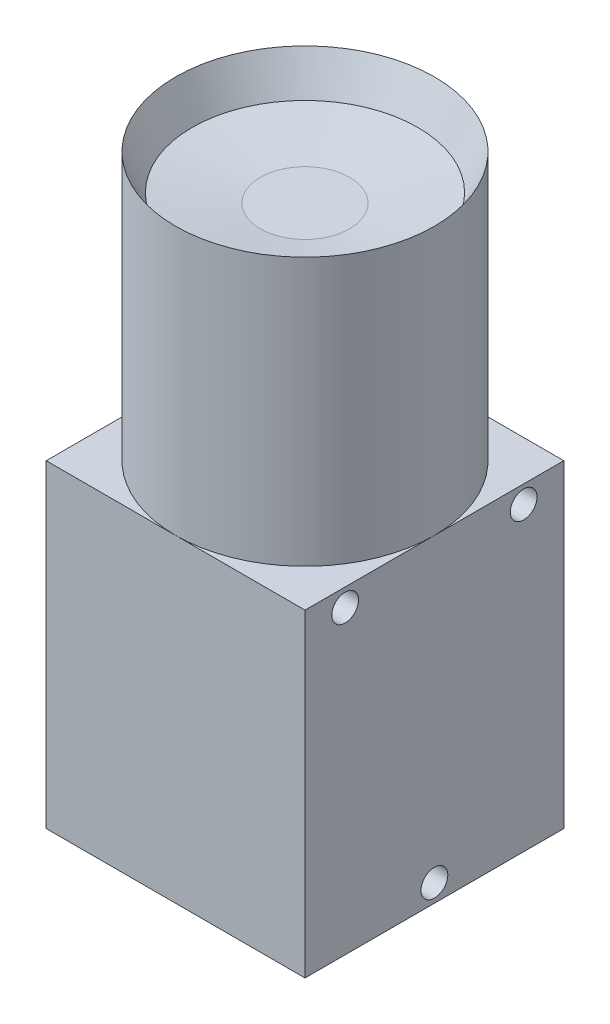
ISO-10303-21;
HEADER;
FILE_DESCRIPTION(('STEP AP214'),'2;1');
FILE_NAME('part.step','',(''),(''),'','','');
FILE_SCHEMA(('AUTOMOTIVE_DESIGN { 1 0 10303 214 1 1 1 1 }'));
ENDSEC;
DATA;
#1=APPLICATION_CONTEXT('core data for automotive mechanical design processes');
#2=APPLICATION_PROTOCOL_DEFINITION('international standard','automotive_design',2000,#1);
#3=PRODUCT_CONTEXT('',#1,'mechanical');
#4=PRODUCT('Part','Part','',(#3));
#5=PRODUCT_RELATED_PRODUCT_CATEGORY('part','',(#4));
#6=PRODUCT_DEFINITION_FORMATION('','',#4);
#7=PRODUCT_DEFINITION_CONTEXT('part definition',#1,'design');
#8=PRODUCT_DEFINITION('design','',#6,#7);
#9=PRODUCT_DEFINITION_SHAPE('','',#8);
#10=(LENGTH_UNIT() NAMED_UNIT(*) SI_UNIT(.MILLI.,.METRE.));
#11=(NAMED_UNIT(*) PLANE_ANGLE_UNIT() SI_UNIT($,.RADIAN.));
#12=(NAMED_UNIT(*) SI_UNIT($,.STERADIAN.) SOLID_ANGLE_UNIT());
#13=UNCERTAINTY_MEASURE_WITH_UNIT(LENGTH_MEASURE(1.E-05),#10,'distance_accuracy_value','');
#14=(GEOMETRIC_REPRESENTATION_CONTEXT(3) GLOBAL_UNCERTAINTY_ASSIGNED_CONTEXT((#13)) GLOBAL_UNIT_ASSIGNED_CONTEXT((#10,
#11,#12)) REPRESENTATION_CONTEXT('',''));
#15=CARTESIAN_POINT('',(0.,0.,0.));
#16=DIRECTION('',(0.,0.,1.));
#17=DIRECTION('',(1.,0.,0.));
#18=AXIS2_PLACEMENT_3D('',#15,#16,#17);
#19=CARTESIAN_POINT('',(10.,-2.,-10.5));
#20=DIRECTION('',(0.,0.,-1.));
#21=DIRECTION('',(-1.,0.,0.));
#22=AXIS2_PLACEMENT_3D('',#19,#20,#21);
#23=PLANE('',#22);
#24=DIRECTION('',(1.,0.,0.));
#25=VECTOR('',#24,1.);
#26=CARTESIAN_POINT('',(-14.501,-0.5857864376269,-10.5));
#27=LINE('',#26,#25);
#28=CARTESIAN_POINT('',(10.5,-0.585786437626899,-10.5));
#29=VERTEX_POINT('',#28);
#30=CARTESIAN_POINT('',(9.50000000000002,-0.585786437626899,-10.5));
#31=VERTEX_POINT('',#30);
#32=EDGE_CURVE('E275',#29,#31,#27,.F.);
#33=ORIENTED_EDGE('',*,*,#32,.T.);
#34=CARTESIAN_POINT('',(10.,-2.,-10.5));
#35=DIRECTION('',(0.,0.,-1.));
#36=DIRECTION('',(-1.,0.,0.));
#37=AXIS2_PLACEMENT_3D('',#34,#35,#36);
#38=CIRCLE('',#37,1.5);
#39=EDGE_CURVE('E139',#31,#29,#38,.T.);
#40=ORIENTED_EDGE('',*,*,#39,.T.);
#41=EDGE_LOOP('',(#33,#40));
#42=FACE_BOUND('',#41,.T.);
#43=ADVANCED_FACE('F35',(#42),#23,.T.);
#44=CARTESIAN_POINT('',(-10.,-2.,-10.5));
#45=DIRECTION('',(0.,0.,1.));
#46=DIRECTION('',(1.,0.,0.));
#47=AXIS2_PLACEMENT_3D('',#44,#45,#46);
#48=PLANE('',#47);
#49=CARTESIAN_POINT('',(-10.,-2.,-10.5));
#50=DIRECTION('',(0.,0.,-1.));
#51=DIRECTION('',(1.,0.,0.));
#52=AXIS2_PLACEMENT_3D('',#49,#50,#51);
#53=CIRCLE('',#52,1.5);
#54=CARTESIAN_POINT('',(-9.50000000000001,-3.4142135623731,-10.5));
#55=VERTEX_POINT('',#54);
#56=CARTESIAN_POINT('',(-10.5,-3.4142135623731,-10.5));
#57=VERTEX_POINT('',#56);
#58=EDGE_CURVE('E127',#55,#57,#53,.T.);
#59=ORIENTED_EDGE('',*,*,#58,.T.);
#60=DIRECTION('',(1.,0.,0.));
#61=VECTOR('',#60,1.);
#62=CARTESIAN_POINT('',(-14.501,-3.4142135623731,-10.5));
#63=LINE('',#62,#61);
#64=EDGE_CURVE('E270',#55,#57,#63,.F.);
#65=ORIENTED_EDGE('',*,*,#64,.F.);
#66=EDGE_LOOP('',(#59,#65));
#67=FACE_BOUND('',#66,.T.);
#68=ADVANCED_FACE('F244',(#67),#48,.F.);
#69=CARTESIAN_POINT('',(0.,25.,0.));
#70=DIRECTION('',(0.,1.,0.));
#71=DIRECTION('',(-1.,0.,0.));
#72=AXIS2_PLACEMENT_3D('',#69,#70,#71);
#73=CYLINDRICAL_SURFACE('',#72,14.5);
#74=CARTESIAN_POINT('',(0.,0.,0.));
#75=DIRECTION('',(0.,1.,0.));
#76=DIRECTION('',(-1.,0.,0.));
#77=AXIS2_PLACEMENT_3D('',#74,#75,#76);
#78=CIRCLE('',#77,14.5);
#79=CARTESIAN_POINT('',(-14.5,0.,0.));
#80=VERTEX_POINT('',#79);
#81=CARTESIAN_POINT('',(0.,0.,14.5));
#82=VERTEX_POINT('',#81);
#83=EDGE_CURVE('E11',#80,#82,#78,.T.);
#84=ORIENTED_EDGE('',*,*,#83,.T.);
#85=CARTESIAN_POINT('',(14.5,0.,0.));
#86=VERTEX_POINT('',#85);
#87=EDGE_CURVE('E43',#82,#86,#78,.T.);
#88=ORIENTED_EDGE('',*,*,#87,.T.);
#89=CARTESIAN_POINT('',(0.,0.,-14.5));
#90=VERTEX_POINT('',#89);
#91=EDGE_CURVE('E193',#86,#90,#78,.T.);
#92=ORIENTED_EDGE('',*,*,#91,.T.);
#93=EDGE_CURVE('E44',#90,#80,#78,.T.);
#94=ORIENTED_EDGE('',*,*,#93,.T.);
#95=EDGE_LOOP('',(#84,#88,#92,#94));
#96=FACE_BOUND('',#95,.T.);
#97=CARTESIAN_POINT('',(0.,30.,0.));
#98=DIRECTION('',(0.,1.,0.));
#99=DIRECTION('',(-1.,0.,0.));
#100=AXIS2_PLACEMENT_3D('',#97,#98,#99);
#101=CIRCLE('',#100,14.5);
#102=CARTESIAN_POINT('',(-14.5,30.,0.));
#103=VERTEX_POINT('',#102);
#104=EDGE_CURVE('E188',#103,#103,#101,.T.);
#105=ORIENTED_EDGE('',*,*,#104,.F.);
#106=EDGE_LOOP('',(#105));
#107=FACE_BOUND('',#106,.T.);
#108=ADVANCED_FACE('F37',(#96,#107),#73,.T.);
#109=CARTESIAN_POINT('',(0.,26.0180368412376,0.));
#110=DIRECTION('',(0.,1.,0.));
#111=DIRECTION('',(-1.,0.,0.));
#112=AXIS2_PLACEMENT_3D('',#109,#110,#111);
#113=CONICAL_SURFACE('',#112,12.6468737891716,0.435570110109196);
#114=ORIENTED_EDGE('',*,*,#104,.T.);
#115=EDGE_LOOP('',(#114));
#116=FACE_BOUND('',#115,.T.);
#117=CARTESIAN_POINT('',(0.,26.0180368412376,0.));
#118=DIRECTION('',(0.,1.,0.));
#119=DIRECTION('',(-1.,0.,0.));
#120=AXIS2_PLACEMENT_3D('',#117,#118,#119);
#121=CIRCLE('',#120,12.6468737891716);
#122=CARTESIAN_POINT('',(-12.6468737891716,26.0180368412376,0.));
#123=VERTEX_POINT('',#122);
#124=EDGE_CURVE('E186',#123,#123,#121,.T.);
#125=ORIENTED_EDGE('',*,*,#124,.F.);
#126=EDGE_LOOP('',(#125));
#127=FACE_BOUND('',#126,.T.);
#128=ADVANCED_FACE('F465',(#116,#127),#113,.F.);
#129=CARTESIAN_POINT('',(0.,25.,0.));
#130=DIRECTION('',(0.,1.,0.));
#131=DIRECTION('',(-1.,0.,0.));
#132=AXIS2_PLACEMENT_3D('',#129,#130,#131);
#133=CONICAL_SURFACE('',#132,5.,1.43844348494106);
#134=ORIENTED_EDGE('',*,*,#124,.T.);
#135=EDGE_LOOP('',(#134));
#136=FACE_BOUND('',#135,.T.);
#137=CARTESIAN_POINT('',(0.,25.,0.));
#138=DIRECTION('',(0.,1.,0.));
#139=DIRECTION('',(-1.,0.,0.));
#140=AXIS2_PLACEMENT_3D('',#137,#138,#139);
#141=CIRCLE('',#140,5.);
#142=CARTESIAN_POINT('',(-5.,25.,0.));
#143=VERTEX_POINT('',#142);
#144=EDGE_CURVE('E183',#143,#143,#141,.T.);
#145=ORIENTED_EDGE('',*,*,#144,.F.);
#146=EDGE_LOOP('',(#145));
#147=FACE_BOUND('',#146,.T.);
#148=ADVANCED_FACE('F456',(#136,#147),#133,.F.);
#149=CARTESIAN_POINT('',(-5.,25.,0.));
#150=DIRECTION('',(0.,1.,0.));
#151=DIRECTION('',(-1.,0.,0.));
#152=AXIS2_PLACEMENT_3D('',#149,#150,#151);
#153=PLANE('',#152);
#154=ORIENTED_EDGE('',*,*,#144,.T.);
#155=EDGE_LOOP('',(#154));
#156=FACE_BOUND('',#155,.T.);
#157=ADVANCED_FACE('F448',(#156),#153,.T.);
#158=CARTESIAN_POINT('',(0.,0.,0.));
#159=DIRECTION('',(0.,-1.,0.));
#160=DIRECTION('',(1.,0.,0.));
#161=AXIS2_PLACEMENT_3D('',#158,#159,#160);
#162=PLANE('',#161);
#163=ORIENTED_EDGE('',*,*,#83,.F.);
#164=DIRECTION('',(0.,0.,-1.));
#165=VECTOR('',#164,1.);
#166=CARTESIAN_POINT('',(-14.5,0.,14.5));
#167=LINE('',#166,#165);
#168=CARTESIAN_POINT('',(-14.5,0.,14.5));
#169=VERTEX_POINT('',#168);
#170=EDGE_CURVE('E167',#169,#80,#167,.T.);
#171=ORIENTED_EDGE('',*,*,#170,.F.);
#172=DIRECTION('',(-1.,0.,0.));
#173=VECTOR('',#172,1.);
#174=CARTESIAN_POINT('',(-14.5,0.,14.5));
#175=LINE('',#174,#173);
#176=EDGE_CURVE('E162',#82,#169,#175,.T.);
#177=ORIENTED_EDGE('',*,*,#176,.F.);
#178=EDGE_LOOP('',(#163,#171,#177));
#179=FACE_BOUND('',#178,.T.);
#180=ADVANCED_FACE('F206',(#179),#162,.F.);
#181=ORIENTED_EDGE('',*,*,#87,.F.);
#182=CARTESIAN_POINT('',(14.5,0.,14.5));
#183=VERTEX_POINT('',#182);
#184=EDGE_CURVE('E163',#183,#82,#175,.T.);
#185=ORIENTED_EDGE('',*,*,#184,.F.);
#186=DIRECTION('',(0.,0.,1.));
#187=VECTOR('',#186,1.);
#188=CARTESIAN_POINT('',(14.5,0.,14.5));
#189=LINE('',#188,#187);
#190=EDGE_CURVE('E142',#86,#183,#189,.T.);
#191=ORIENTED_EDGE('',*,*,#190,.F.);
#192=EDGE_LOOP('',(#181,#185,#191));
#193=FACE_BOUND('',#192,.T.);
#194=ADVANCED_FACE('F203',(#193),#162,.F.);
#195=ORIENTED_EDGE('',*,*,#91,.F.);
#196=CARTESIAN_POINT('',(14.5,0.,-14.5));
#197=VERTEX_POINT('',#196);
#198=EDGE_CURVE('E159',#197,#86,#189,.T.);
#199=ORIENTED_EDGE('',*,*,#198,.F.);
#200=DIRECTION('',(1.,0.,0.));
#201=VECTOR('',#200,1.);
#202=CARTESIAN_POINT('',(-14.5,0.,-14.5));
#203=LINE('',#202,#201);
#204=EDGE_CURVE('E169',#90,#197,#203,.T.);
#205=ORIENTED_EDGE('',*,*,#204,.F.);
#206=EDGE_LOOP('',(#195,#199,#205));
#207=FACE_BOUND('',#206,.T.);
#208=ADVANCED_FACE('F218',(#207),#162,.F.);
#209=CARTESIAN_POINT('',(14.5,-35.7,14.5));
#210=DIRECTION('',(-1.,0.,0.));
#211=DIRECTION('',(0.,-1.,0.));
#212=AXIS2_PLACEMENT_3D('',#209,#210,#211);
#213=PLANE('',#212);
#214=CARTESIAN_POINT('',(14.5,-2.,10.));
#215=DIRECTION('',(1.,0.,0.));
#216=DIRECTION('',(0.,1.,0.));
#217=AXIS2_PLACEMENT_3D('',#214,#215,#216);
#218=CIRCLE('',#217,1.5);
#219=CARTESIAN_POINT('',(14.5,-0.499999999999997,10.));
#220=VERTEX_POINT('',#219);
#221=EDGE_CURVE('E498',#220,#220,#218,.T.);
#222=ORIENTED_EDGE('',*,*,#221,.F.);
#223=EDGE_LOOP('',(#222));
#224=FACE_BOUND('',#223,.T.);
#225=CARTESIAN_POINT('',(14.5,-33.7,0.));
#226=DIRECTION('',(1.,0.,0.));
#227=DIRECTION('',(0.,1.,0.));
#228=AXIS2_PLACEMENT_3D('',#225,#226,#227);
#229=CIRCLE('',#228,1.5);
#230=CARTESIAN_POINT('',(14.5,-32.2,0.));
#231=VERTEX_POINT('',#230);
#232=EDGE_CURVE('E283',#231,#231,#229,.T.);
#233=ORIENTED_EDGE('',*,*,#232,.F.);
#234=EDGE_LOOP('',(#233));
#235=FACE_BOUND('',#234,.T.);
#236=CARTESIAN_POINT('',(14.5,-2.,-10.));
#237=DIRECTION('',(1.,0.,0.));
#238=DIRECTION('',(0.,-1.,0.));
#239=AXIS2_PLACEMENT_3D('',#236,#237,#238);
#240=CIRCLE('',#239,1.5);
#241=CARTESIAN_POINT('',(14.5,-3.5,-10.));
#242=VERTEX_POINT('',#241);
#243=EDGE_CURVE('E119',#242,#242,#240,.T.);
#244=ORIENTED_EDGE('',*,*,#243,.F.);
#245=EDGE_LOOP('',(#244));
#246=FACE_BOUND('',#245,.T.);
#247=ORIENTED_EDGE('',*,*,#198,.T.);
#248=ORIENTED_EDGE('',*,*,#190,.T.);
#249=DIRECTION('',(0.,1.,0.));
#250=VECTOR('',#249,1.);
#251=CARTESIAN_POINT('',(14.5,-35.7,14.5));
#252=LINE('',#251,#250);
#253=CARTESIAN_POINT('',(14.5,-35.7,14.5));
#254=VERTEX_POINT('',#253);
#255=EDGE_CURVE('E180',#254,#183,#252,.T.);
#256=ORIENTED_EDGE('',*,*,#255,.F.);
#257=DIRECTION('',(0.,0.,1.));
#258=VECTOR('',#257,1.);
#259=CARTESIAN_POINT('',(14.5,-35.7,14.5));
#260=LINE('',#259,#258);
#261=CARTESIAN_POINT('',(14.5,-35.7,-14.5));
#262=VERTEX_POINT('',#261);
#263=EDGE_CURVE('E148',#262,#254,#260,.T.);
#264=ORIENTED_EDGE('',*,*,#263,.F.);
#265=DIRECTION('',(0.,1.,0.));
#266=VECTOR('',#265,1.);
#267=CARTESIAN_POINT('',(14.5,-35.7,-14.5));
#268=LINE('',#267,#266);
#269=EDGE_CURVE('E158',#262,#197,#268,.T.);
#270=ORIENTED_EDGE('',*,*,#269,.T.);
#271=EDGE_LOOP('',(#247,#248,#256,#264,#270));
#272=FACE_BOUND('',#271,.T.);
#273=ADVANCED_FACE('F213',(#224,#235,#246,#272),#213,.F.);
#274=CARTESIAN_POINT('',(-14.5,-35.7,14.5));
#275=DIRECTION('',(0.,0.,-1.));
#276=DIRECTION('',(-1.,0.,0.));
#277=AXIS2_PLACEMENT_3D('',#274,#275,#276);
#278=PLANE('',#277);
#279=ORIENTED_EDGE('',*,*,#184,.T.);
#280=ORIENTED_EDGE('',*,*,#176,.T.);
#281=DIRECTION('',(0.,1.,0.));
#282=VECTOR('',#281,1.);
#283=CARTESIAN_POINT('',(-14.5,-35.7,14.5));
#284=LINE('',#283,#282);
#285=CARTESIAN_POINT('',(-14.5,-35.7,14.5));
#286=VERTEX_POINT('',#285);
#287=EDGE_CURVE('E177',#286,#169,#284,.T.);
#288=ORIENTED_EDGE('',*,*,#287,.F.);
#289=DIRECTION('',(-1.,0.,0.));
#290=VECTOR('',#289,1.);
#291=CARTESIAN_POINT('',(-14.5,-35.7,14.5));
#292=LINE('',#291,#290);
#293=EDGE_CURVE('E151',#254,#286,#292,.T.);
#294=ORIENTED_EDGE('',*,*,#293,.F.);
#295=ORIENTED_EDGE('',*,*,#255,.T.);
#296=EDGE_LOOP('',(#279,#280,#288,#294,#295));
#297=FACE_BOUND('',#296,.T.);
#298=ADVANCED_FACE('F209',(#297),#278,.F.);
#299=CARTESIAN_POINT('',(-14.5,-35.7,14.5));
#300=DIRECTION('',(1.,0.,0.));
#301=DIRECTION('',(0.,1.,0.));
#302=AXIS2_PLACEMENT_3D('',#299,#300,#301);
#303=PLANE('',#302);
#304=CARTESIAN_POINT('',(-14.5,-2.,10.));
#305=DIRECTION('',(1.,0.,0.));
#306=DIRECTION('',(0.,1.,0.));
#307=AXIS2_PLACEMENT_3D('',#304,#305,#306);
#308=CIRCLE('',#307,1.5);
#309=CARTESIAN_POINT('',(-14.5,-0.499999999999998,10.));
#310=VERTEX_POINT('',#309);
#311=EDGE_CURVE('E134',#310,#310,#308,.F.);
#312=ORIENTED_EDGE('',*,*,#311,.F.);
#313=EDGE_LOOP('',(#312));
#314=FACE_BOUND('',#313,.T.);
#315=CARTESIAN_POINT('',(-14.5,-33.7,0.));
#316=DIRECTION('',(1.,0.,0.));
#317=DIRECTION('',(0.,1.,0.));
#318=AXIS2_PLACEMENT_3D('',#315,#316,#317);
#319=CIRCLE('',#318,1.5);
#320=CARTESIAN_POINT('',(-14.5,-32.2,0.));
#321=VERTEX_POINT('',#320);
#322=EDGE_CURVE('E506',#321,#321,#319,.F.);
#323=ORIENTED_EDGE('',*,*,#322,.F.);
#324=EDGE_LOOP('',(#323));
#325=FACE_BOUND('',#324,.T.);
#326=CARTESIAN_POINT('',(-14.5,-2.,-10.));
#327=DIRECTION('',(1.,0.,0.));
#328=DIRECTION('',(0.,1.,0.));
#329=AXIS2_PLACEMENT_3D('',#326,#327,#328);
#330=CIRCLE('',#329,1.5);
#331=CARTESIAN_POINT('',(-14.5,-0.499999999999998,-10.));
#332=VERTEX_POINT('',#331);
#333=EDGE_CURVE('E277',#332,#332,#330,.F.);
#334=ORIENTED_EDGE('',*,*,#333,.F.);
#335=EDGE_LOOP('',(#334));
#336=FACE_BOUND('',#335,.T.);
#337=ORIENTED_EDGE('',*,*,#170,.T.);
#338=CARTESIAN_POINT('',(-14.5,0.,-14.5));
#339=VERTEX_POINT('',#338);
#340=EDGE_CURVE('E166',#80,#339,#167,.T.);
#341=ORIENTED_EDGE('',*,*,#340,.T.);
#342=DIRECTION('',(0.,1.,0.));
#343=VECTOR('',#342,1.);
#344=CARTESIAN_POINT('',(-14.5,-35.7,-14.5));
#345=LINE('',#344,#343);
#346=CARTESIAN_POINT('',(-14.5,-35.7,-14.5));
#347=VERTEX_POINT('',#346);
#348=EDGE_CURVE('E174',#347,#339,#345,.T.);
#349=ORIENTED_EDGE('',*,*,#348,.F.);
#350=DIRECTION('',(0.,0.,-1.));
#351=VECTOR('',#350,1.);
#352=CARTESIAN_POINT('',(-14.5,-35.7,14.5));
#353=LINE('',#352,#351);
#354=EDGE_CURVE('E154',#286,#347,#353,.T.);
#355=ORIENTED_EDGE('',*,*,#354,.F.);
#356=ORIENTED_EDGE('',*,*,#287,.T.);
#357=EDGE_LOOP('',(#337,#341,#349,#355,#356));
#358=FACE_BOUND('',#357,.T.);
#359=ADVANCED_FACE('F228',(#314,#325,#336,#358),#303,.F.);
#360=CARTESIAN_POINT('',(-14.5,-35.7,-14.5));
#361=DIRECTION('',(0.,0.,1.));
#362=DIRECTION('',(1.,0.,0.));
#363=AXIS2_PLACEMENT_3D('',#360,#361,#362);
#364=PLANE('',#363);
#365=CARTESIAN_POINT('',(-10.,-2.,-14.5));
#366=DIRECTION('',(0.,0.,-1.));
#367=DIRECTION('',(1.,0.,0.));
#368=AXIS2_PLACEMENT_3D('',#365,#366,#367);
#369=CIRCLE('',#368,1.5);
#370=CARTESIAN_POINT('',(-8.5,-2.,-14.5));
#371=VERTEX_POINT('',#370);
#372=EDGE_CURVE('E130',#371,#371,#369,.T.);
#373=ORIENTED_EDGE('',*,*,#372,.F.);
#374=EDGE_LOOP('',(#373));
#375=FACE_BOUND('',#374,.T.);
#376=CARTESIAN_POINT('',(-10.,-33.7,-14.5));
#377=DIRECTION('',(0.,0.,-1.));
#378=DIRECTION('',(1.,0.,0.));
#379=AXIS2_PLACEMENT_3D('',#376,#377,#378);
#380=CIRCLE('',#379,1.5);
#381=CARTESIAN_POINT('',(-8.5,-33.7,-14.5));
#382=VERTEX_POINT('',#381);
#383=EDGE_CURVE('E132',#382,#382,#380,.T.);
#384=ORIENTED_EDGE('',*,*,#383,.F.);
#385=EDGE_LOOP('',(#384));
#386=FACE_BOUND('',#385,.T.);
#387=CARTESIAN_POINT('',(10.,-33.7,-14.5));
#388=DIRECTION('',(0.,0.,-1.));
#389=DIRECTION('',(-1.,0.,0.));
#390=AXIS2_PLACEMENT_3D('',#387,#388,#389);
#391=CIRCLE('',#390,1.5);
#392=CARTESIAN_POINT('',(8.5,-33.7,-14.5));
#393=VERTEX_POINT('',#392);
#394=EDGE_CURVE('E286',#393,#393,#391,.T.);
#395=ORIENTED_EDGE('',*,*,#394,.F.);
#396=EDGE_LOOP('',(#395));
#397=FACE_BOUND('',#396,.T.);
#398=CARTESIAN_POINT('',(10.,-2.,-14.5));
#399=DIRECTION('',(0.,0.,-1.));
#400=DIRECTION('',(-1.,0.,0.));
#401=AXIS2_PLACEMENT_3D('',#398,#399,#400);
#402=CIRCLE('',#401,1.5);
#403=CARTESIAN_POINT('',(8.5,-2.,-14.5));
#404=VERTEX_POINT('',#403);
#405=EDGE_CURVE('E144',#404,#404,#402,.T.);
#406=ORIENTED_EDGE('',*,*,#405,.F.);
#407=EDGE_LOOP('',(#406));
#408=FACE_BOUND('',#407,.T.);
#409=EDGE_CURVE('E152',#339,#90,#203,.T.);
#410=ORIENTED_EDGE('',*,*,#409,.T.);
#411=ORIENTED_EDGE('',*,*,#204,.T.);
#412=ORIENTED_EDGE('',*,*,#269,.F.);
#413=DIRECTION('',(1.,0.,0.));
#414=VECTOR('',#413,1.);
#415=CARTESIAN_POINT('',(-14.5,-35.7,-14.5));
#416=LINE('',#415,#414);
#417=EDGE_CURVE('E156',#347,#262,#416,.T.);
#418=ORIENTED_EDGE('',*,*,#417,.F.);
#419=ORIENTED_EDGE('',*,*,#348,.T.);
#420=EDGE_LOOP('',(#410,#411,#412,#418,#419));
#421=FACE_BOUND('',#420,.T.);
#422=ADVANCED_FACE('F221',(#375,#386,#397,#408,#421),#364,.F.);
#423=CARTESIAN_POINT('',(0.,-35.7,0.));
#424=DIRECTION('',(0.,-1.,0.));
#425=DIRECTION('',(1.,0.,0.));
#426=AXIS2_PLACEMENT_3D('',#423,#424,#425);
#427=PLANE('',#426);
#428=ORIENTED_EDGE('',*,*,#263,.T.);
#429=ORIENTED_EDGE('',*,*,#293,.T.);
#430=ORIENTED_EDGE('',*,*,#354,.T.);
#431=ORIENTED_EDGE('',*,*,#417,.T.);
#432=EDGE_LOOP('',(#428,#429,#430,#431));
#433=FACE_BOUND('',#432,.T.);
#434=ADVANCED_FACE('F231',(#433),#427,.T.);
#435=ORIENTED_EDGE('',*,*,#93,.F.);
#436=ORIENTED_EDGE('',*,*,#409,.F.);
#437=ORIENTED_EDGE('',*,*,#340,.F.);
#438=EDGE_LOOP('',(#435,#436,#437));
#439=FACE_BOUND('',#438,.T.);
#440=ADVANCED_FACE('F226',(#439),#162,.F.);
#441=CARTESIAN_POINT('',(10.,-2.,-10.5));
#442=DIRECTION('',(0.,0.,-1.));
#443=DIRECTION('',(-1.,0.,0.));
#444=AXIS2_PLACEMENT_3D('',#441,#442,#443);
#445=CYLINDRICAL_SURFACE('',#444,1.5);
#446=ORIENTED_EDGE('',*,*,#39,.F.);
#447=CARTESIAN_POINT('',(10.,-2.,-10.));
#448=DIRECTION('',(0.707106781186547,0.,-0.707106781186547));
#449=DIRECTION('',(0.707106781186547,0.,0.707106781186547));
#450=AXIS2_PLACEMENT_3D('',#447,#448,#449);
#451=ELLIPSE('',#450,2.12132034355964,1.5);
#452=CARTESIAN_POINT('',(9.50000000000001,-3.4142135623731,-10.5));
#453=VERTEX_POINT('',#452);
#454=EDGE_CURVE('E274',#453,#31,#451,.T.);
#455=ORIENTED_EDGE('',*,*,#454,.F.);
#456=CARTESIAN_POINT('',(10.5,-3.4142135623731,-10.5));
#457=VERTEX_POINT('',#456);
#458=EDGE_CURVE('E143',#457,#453,#38,.T.);
#459=ORIENTED_EDGE('',*,*,#458,.F.);
#460=CARTESIAN_POINT('',(10.,-2.,-10.));
#461=DIRECTION('',(0.707106781186547,0.,0.707106781186547));
#462=DIRECTION('',(0.707106781186547,0.,-0.707106781186547));
#463=AXIS2_PLACEMENT_3D('',#460,#461,#462);
#464=ELLIPSE('',#463,2.12132034355964,1.5);
#465=EDGE_CURVE('E51',#29,#457,#464,.F.);
#466=ORIENTED_EDGE('',*,*,#465,.F.);
#467=EDGE_LOOP('',(#446,#455,#459,#466));
#468=FACE_BOUND('',#467,.T.);
#469=ORIENTED_EDGE('',*,*,#405,.T.);
#470=EDGE_LOOP('',(#469));
#471=FACE_BOUND('',#470,.T.);
#472=ADVANCED_FACE('F238',(#468,#471),#445,.F.);
#473=DIRECTION('',(1.,0.,0.));
#474=VECTOR('',#473,1.);
#475=CARTESIAN_POINT('',(-14.501,-3.4142135623731,-10.5));
#476=LINE('',#475,#474);
#477=EDGE_CURVE('E267',#453,#457,#476,.T.);
#478=ORIENTED_EDGE('',*,*,#477,.T.);
#479=ORIENTED_EDGE('',*,*,#458,.T.);
#480=EDGE_LOOP('',(#478,#479));
#481=FACE_BOUND('',#480,.T.);
#482=ADVANCED_FACE('F247',(#481),#23,.T.);
#483=CARTESIAN_POINT('',(10.,-33.7,-10.5));
#484=DIRECTION('',(0.,0.,-1.));
#485=DIRECTION('',(-1.,0.,0.));
#486=AXIS2_PLACEMENT_3D('',#483,#484,#485);
#487=CYLINDRICAL_SURFACE('',#486,1.5);
#488=CARTESIAN_POINT('',(10.,-33.7,-10.5));
#489=DIRECTION('',(0.,0.,-1.));
#490=DIRECTION('',(-1.,0.,0.));
#491=AXIS2_PLACEMENT_3D('',#488,#489,#490);
#492=CIRCLE('',#491,1.5);
#493=CARTESIAN_POINT('',(8.5,-33.7,-10.5));
#494=VERTEX_POINT('',#493);
#495=EDGE_CURVE('E147',#494,#494,#492,.T.);
#496=ORIENTED_EDGE('',*,*,#495,.F.);
#497=EDGE_LOOP('',(#496));
#498=FACE_BOUND('',#497,.T.);
#499=ORIENTED_EDGE('',*,*,#394,.T.);
#500=EDGE_LOOP('',(#499));
#501=FACE_BOUND('',#500,.T.);
#502=ADVANCED_FACE('F256',(#498,#501),#487,.F.);
#503=CARTESIAN_POINT('',(10.,-33.7,-10.5));
#504=DIRECTION('',(0.,0.,-1.));
#505=DIRECTION('',(-1.,0.,0.));
#506=AXIS2_PLACEMENT_3D('',#503,#504,#505);
#507=PLANE('',#506);
#508=ORIENTED_EDGE('',*,*,#495,.T.);
#509=EDGE_LOOP('',(#508));
#510=FACE_BOUND('',#509,.T.);
#511=ADVANCED_FACE('F262',(#510),#507,.T.);
#512=CARTESIAN_POINT('',(-10.,-33.7,-10.5));
#513=DIRECTION('',(0.,0.,-1.));
#514=DIRECTION('',(-1.,0.,0.));
#515=AXIS2_PLACEMENT_3D('',#512,#513,#514);
#516=CYLINDRICAL_SURFACE('',#515,1.5);
#517=CARTESIAN_POINT('',(-10.,-33.7,-10.5));
#518=DIRECTION('',(0.,0.,-1.));
#519=DIRECTION('',(1.,0.,0.));
#520=AXIS2_PLACEMENT_3D('',#517,#518,#519);
#521=CIRCLE('',#520,1.5);
#522=CARTESIAN_POINT('',(-8.5,-33.7,-10.5));
#523=VERTEX_POINT('',#522);
#524=EDGE_CURVE('E288',#523,#523,#521,.T.);
#525=ORIENTED_EDGE('',*,*,#524,.F.);
#526=EDGE_LOOP('',(#525));
#527=FACE_BOUND('',#526,.T.);
#528=ORIENTED_EDGE('',*,*,#383,.T.);
#529=EDGE_LOOP('',(#528));
#530=FACE_BOUND('',#529,.T.);
#531=ADVANCED_FACE('F295',(#527,#530),#516,.F.);
#532=CARTESIAN_POINT('',(-10.,-33.7,-10.5));
#533=DIRECTION('',(0.,0.,1.));
#534=DIRECTION('',(1.,0.,0.));
#535=AXIS2_PLACEMENT_3D('',#532,#533,#534);
#536=PLANE('',#535);
#537=ORIENTED_EDGE('',*,*,#524,.T.);
#538=EDGE_LOOP('',(#537));
#539=FACE_BOUND('',#538,.T.);
#540=ADVANCED_FACE('F303',(#539),#536,.F.);
#541=CARTESIAN_POINT('',(-10.,-2.,-10.5));
#542=DIRECTION('',(0.,0.,-1.));
#543=DIRECTION('',(-1.,0.,0.));
#544=AXIS2_PLACEMENT_3D('',#541,#542,#543);
#545=CYLINDRICAL_SURFACE('',#544,1.5);
#546=CARTESIAN_POINT('',(-10.5,-0.5857864376269,-10.5));
#547=VERTEX_POINT('',#546);
#548=CARTESIAN_POINT('',(-9.50000000000002,-0.5857864376269,-10.5));
#549=VERTEX_POINT('',#548);
#550=EDGE_CURVE('E125',#547,#549,#53,.T.);
#551=ORIENTED_EDGE('',*,*,#550,.F.);
#552=CARTESIAN_POINT('',(-10.,-2.,-10.));
#553=DIRECTION('',(0.707106781186547,0.,-0.707106781186547));
#554=DIRECTION('',(0.707106781186547,0.,0.707106781186547));
#555=AXIS2_PLACEMENT_3D('',#552,#553,#554);
#556=ELLIPSE('',#555,2.12132034355964,1.5);
#557=EDGE_CURVE('E59',#57,#547,#556,.T.);
#558=ORIENTED_EDGE('',*,*,#557,.F.);
#559=ORIENTED_EDGE('',*,*,#58,.F.);
#560=CARTESIAN_POINT('',(-10.,-2.,-10.));
#561=DIRECTION('',(0.707106781186547,0.,0.707106781186547));
#562=DIRECTION('',(0.707106781186547,0.,-0.707106781186547));
#563=AXIS2_PLACEMENT_3D('',#560,#561,#562);
#564=ELLIPSE('',#563,2.12132034355964,1.5);
#565=EDGE_CURVE('E114',#549,#55,#564,.F.);
#566=ORIENTED_EDGE('',*,*,#565,.F.);
#567=EDGE_LOOP('',(#551,#558,#559,#566));
#568=FACE_BOUND('',#567,.T.);
#569=ORIENTED_EDGE('',*,*,#372,.T.);
#570=EDGE_LOOP('',(#569));
#571=FACE_BOUND('',#570,.T.);
#572=ADVANCED_FACE('F123',(#568,#571),#545,.F.);
#573=ORIENTED_EDGE('',*,*,#550,.T.);
#574=DIRECTION('',(1.,0.,0.));
#575=VECTOR('',#574,1.);
#576=CARTESIAN_POINT('',(-14.501,-0.5857864376269,-10.5));
#577=LINE('',#576,#575);
#578=EDGE_CURVE('E110',#547,#549,#577,.T.);
#579=ORIENTED_EDGE('',*,*,#578,.F.);
#580=EDGE_LOOP('',(#573,#579));
#581=FACE_BOUND('',#580,.T.);
#582=ADVANCED_FACE('F129',(#581),#48,.F.);
#583=CARTESIAN_POINT('',(-14.501,-2.,-10.));
#584=DIRECTION('',(1.,0.,0.));
#585=DIRECTION('',(0.,1.,0.));
#586=AXIS2_PLACEMENT_3D('',#583,#584,#585);
#587=CYLINDRICAL_SURFACE('',#586,1.5);
#588=ORIENTED_EDGE('',*,*,#64,.T.);
#589=ORIENTED_EDGE('',*,*,#557,.T.);
#590=ORIENTED_EDGE('',*,*,#578,.T.);
#591=ORIENTED_EDGE('',*,*,#565,.T.);
#592=EDGE_LOOP('',(#588,#589,#590,#591));
#593=FACE_BOUND('',#592,.T.);
#594=ORIENTED_EDGE('',*,*,#243,.T.);
#595=EDGE_LOOP('',(#594));
#596=FACE_BOUND('',#595,.T.);
#597=ORIENTED_EDGE('',*,*,#465,.T.);
#598=ORIENTED_EDGE('',*,*,#477,.F.);
#599=ORIENTED_EDGE('',*,*,#454,.T.);
#600=ORIENTED_EDGE('',*,*,#32,.F.);
#601=EDGE_LOOP('',(#597,#598,#599,#600));
#602=FACE_BOUND('',#601,.T.);
#603=ORIENTED_EDGE('',*,*,#333,.T.);
#604=EDGE_LOOP('',(#603));
#605=FACE_BOUND('',#604,.T.);
#606=ADVANCED_FACE('F112',(#593,#596,#602,#605),#587,.F.);
#607=CARTESIAN_POINT('',(-14.501,-33.7,0.));
#608=DIRECTION('',(1.,0.,0.));
#609=DIRECTION('',(0.,1.,0.));
#610=AXIS2_PLACEMENT_3D('',#607,#608,#609);
#611=CYLINDRICAL_SURFACE('',#610,1.5);
#612=ORIENTED_EDGE('',*,*,#232,.T.);
#613=EDGE_LOOP('',(#612));
#614=FACE_BOUND('',#613,.T.);
#615=ORIENTED_EDGE('',*,*,#322,.T.);
#616=EDGE_LOOP('',(#615));
#617=FACE_BOUND('',#616,.T.);
#618=ADVANCED_FACE('F329',(#614,#617),#611,.F.);
#619=CARTESIAN_POINT('',(-14.501,-2.,10.));
#620=DIRECTION('',(1.,0.,0.));
#621=DIRECTION('',(0.,1.,0.));
#622=AXIS2_PLACEMENT_3D('',#619,#620,#621);
#623=CYLINDRICAL_SURFACE('',#622,1.5);
#624=ORIENTED_EDGE('',*,*,#221,.T.);
#625=EDGE_LOOP('',(#624));
#626=FACE_BOUND('',#625,.T.);
#627=ORIENTED_EDGE('',*,*,#311,.T.);
#628=EDGE_LOOP('',(#627));
#629=FACE_BOUND('',#628,.T.);
#630=ADVANCED_FACE('F336',(#626,#629),#623,.F.);
#631=CLOSED_SHELL('',(#43,#68,#108,#128,#148,#157,#180,#194,#208,#273,#298,#359,#422,#434,#440,
#472,#482,#502,#511,#531,#540,#572,#582,#606,#618,#630));
#632=MANIFOLD_SOLID_BREP('B2',#631);
#633=ADVANCED_BREP_SHAPE_REPRESENTATION('',(#18,#632),#14);
#634=SHAPE_DEFINITION_REPRESENTATION(#9,#633);
ENDSEC;
END-ISO-10303-21;
